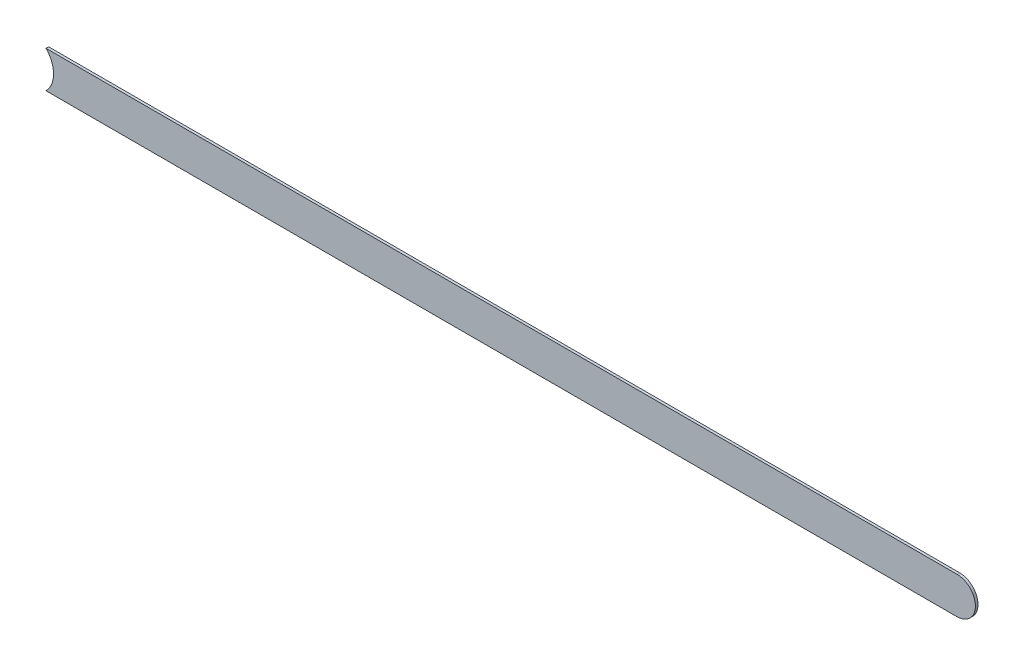
ISO-10303-21;
HEADER;
FILE_DESCRIPTION(('STEP AP214'),'2;1');
FILE_NAME('part.step','',(''),(''),'','','');
FILE_SCHEMA(('AUTOMOTIVE_DESIGN { 1 0 10303 214 1 1 1 1 }'));
ENDSEC;
DATA;
#1=APPLICATION_CONTEXT('core data for automotive mechanical design processes');
#2=APPLICATION_PROTOCOL_DEFINITION('international standard','automotive_design',2000,#1);
#3=PRODUCT_CONTEXT('',#1,'mechanical');
#4=PRODUCT('Part','Part','',(#3));
#5=PRODUCT_RELATED_PRODUCT_CATEGORY('part','',(#4));
#6=PRODUCT_DEFINITION_FORMATION('','',#4);
#7=PRODUCT_DEFINITION_CONTEXT('part definition',#1,'design');
#8=PRODUCT_DEFINITION('design','',#6,#7);
#9=PRODUCT_DEFINITION_SHAPE('','',#8);
#10=(LENGTH_UNIT() NAMED_UNIT(*) SI_UNIT(.MILLI.,.METRE.));
#11=(NAMED_UNIT(*) PLANE_ANGLE_UNIT() SI_UNIT($,.RADIAN.));
#12=(NAMED_UNIT(*) SI_UNIT($,.STERADIAN.) SOLID_ANGLE_UNIT());
#13=UNCERTAINTY_MEASURE_WITH_UNIT(LENGTH_MEASURE(1.E-05),#10,'distance_accuracy_value','');
#14=(GEOMETRIC_REPRESENTATION_CONTEXT(3) GLOBAL_UNCERTAINTY_ASSIGNED_CONTEXT((#13)) GLOBAL_UNIT_ASSIGNED_CONTEXT((#10,
#11,#12)) REPRESENTATION_CONTEXT('',''));
#15=CARTESIAN_POINT('',(0.,0.,0.));
#16=DIRECTION('',(0.,0.,1.));
#17=DIRECTION('',(1.,0.,0.));
#18=AXIS2_PLACEMENT_3D('',#15,#16,#17);
#19=CARTESIAN_POINT('',(55.9157571955931,69.32484738,0.));
#20=DIRECTION('',(0.,1.,0.));
#21=DIRECTION('',(1.,0.,0.));
#22=AXIS2_PLACEMENT_3D('',#19,#20,#21);
#23=PLANE('',#22);
#24=DIRECTION('',(1.,0.,0.));
#25=VECTOR('',#24,1.);
#26=CARTESIAN_POINT('',(55.66287064,69.32484738,0.03556));
#27=LINE('',#26,#25);
#28=CARTESIAN_POINT('',(55.9157571955931,69.32484738,0.03556));
#29=VERTEX_POINT('',#28);
#30=CARTESIAN_POINT('',(68.29635312,69.32484738,0.03556));
#31=VERTEX_POINT('',#30);
#32=EDGE_CURVE('E11',#29,#31,#27,.T.);
#33=ORIENTED_EDGE('',*,*,#32,.F.);
#34=DIRECTION('',(0.,0.,1.));
#35=VECTOR('',#34,1.);
#36=CARTESIAN_POINT('',(55.9157571955931,69.32484738,0.));
#37=LINE('',#36,#35);
#38=CARTESIAN_POINT('',(55.9157571955931,69.32484738,0.));
#39=VERTEX_POINT('',#38);
#40=EDGE_CURVE('E24',#39,#29,#37,.T.);
#41=ORIENTED_EDGE('',*,*,#40,.F.);
#42=DIRECTION('',(1.,0.,0.));
#43=VECTOR('',#42,1.);
#44=CARTESIAN_POINT('',(55.66287064,69.32484738,0.));
#45=LINE('',#44,#43);
#46=CARTESIAN_POINT('',(68.29635312,69.32484738,0.));
#47=VERTEX_POINT('',#46);
#48=EDGE_CURVE('E82',#39,#47,#45,.T.);
#49=ORIENTED_EDGE('',*,*,#48,.T.);
#50=DIRECTION('',(0.,0.,1.));
#51=VECTOR('',#50,1.);
#52=CARTESIAN_POINT('',(68.29635312,69.32484738,0.));
#53=LINE('',#52,#51);
#54=EDGE_CURVE('E37',#47,#31,#53,.T.);
#55=ORIENTED_EDGE('',*,*,#54,.T.);
#56=EDGE_LOOP('',(#33,#41,#49,#55));
#57=FACE_BOUND('',#56,.T.);
#58=ADVANCED_FACE('F17',(#57),#23,.F.);
#59=CARTESIAN_POINT('',(68.29635312,69.57484688,0.));
#60=DIRECTION('',(0.,0.,-1.));
#61=DIRECTION('',(0.,-1.,0.));
#62=AXIS2_PLACEMENT_3D('',#59,#60,#61);
#63=CYLINDRICAL_SURFACE('',#62,0.249999500000001);
#64=CARTESIAN_POINT('',(68.29635312,69.57484688,0.03556));
#65=DIRECTION('',(0.,0.,1.));
#66=DIRECTION('',(0.,-1.,0.));
#67=AXIS2_PLACEMENT_3D('',#64,#65,#66);
#68=CIRCLE('',#67,0.249999500000001);
#69=CARTESIAN_POINT('',(68.29635312,69.82484638,0.03556));
#70=VERTEX_POINT('',#69);
#71=EDGE_CURVE('E97',#31,#70,#68,.T.);
#72=ORIENTED_EDGE('',*,*,#71,.F.);
#73=ORIENTED_EDGE('',*,*,#54,.F.);
#74=CARTESIAN_POINT('',(68.29635312,69.57484688,0.));
#75=DIRECTION('',(0.,0.,1.));
#76=DIRECTION('',(0.,-1.,0.));
#77=AXIS2_PLACEMENT_3D('',#74,#75,#76);
#78=CIRCLE('',#77,0.249999500000001);
#79=CARTESIAN_POINT('',(68.29635312,69.82484638,0.));
#80=VERTEX_POINT('',#79);
#81=EDGE_CURVE('E94',#47,#80,#78,.T.);
#82=ORIENTED_EDGE('',*,*,#81,.T.);
#83=DIRECTION('',(0.,0.,1.));
#84=VECTOR('',#83,1.);
#85=CARTESIAN_POINT('',(68.29635312,69.82484638,0.));
#86=LINE('',#85,#84);
#87=EDGE_CURVE('E92',#80,#70,#86,.T.);
#88=ORIENTED_EDGE('',*,*,#87,.T.);
#89=EDGE_LOOP('',(#72,#73,#82,#88));
#90=FACE_BOUND('',#89,.T.);
#91=ADVANCED_FACE('F103',(#90),#63,.T.);
#92=CARTESIAN_POINT('',(68.29635312,69.82484638,0.));
#93=DIRECTION('',(0.,-1.,0.));
#94=DIRECTION('',(-1.,0.,0.));
#95=AXIS2_PLACEMENT_3D('',#92,#93,#94);
#96=PLANE('',#95);
#97=DIRECTION('',(-1.,0.,0.));
#98=VECTOR('',#97,1.);
#99=CARTESIAN_POINT('',(68.29635312,69.82484638,0.03556));
#100=LINE('',#99,#98);
#101=CARTESIAN_POINT('',(55.9157571955931,69.82484638,0.03556));
#102=VERTEX_POINT('',#101);
#103=EDGE_CURVE('E89',#70,#102,#100,.T.);
#104=ORIENTED_EDGE('',*,*,#103,.F.);
#105=ORIENTED_EDGE('',*,*,#87,.F.);
#106=DIRECTION('',(-1.,0.,0.));
#107=VECTOR('',#106,1.);
#108=CARTESIAN_POINT('',(68.29635312,69.82484638,0.));
#109=LINE('',#108,#107);
#110=CARTESIAN_POINT('',(55.9157571955931,69.82484638,0.));
#111=VERTEX_POINT('',#110);
#112=EDGE_CURVE('E87',#80,#111,#109,.T.);
#113=ORIENTED_EDGE('',*,*,#112,.T.);
#114=DIRECTION('',(0.,0.,1.));
#115=VECTOR('',#114,1.);
#116=CARTESIAN_POINT('',(55.9157571955931,69.82484638,0.));
#117=LINE('',#116,#115);
#118=EDGE_CURVE('E69',#111,#102,#117,.T.);
#119=ORIENTED_EDGE('',*,*,#118,.T.);
#120=EDGE_LOOP('',(#104,#105,#113,#119));
#121=FACE_BOUND('',#120,.T.);
#122=ADVANCED_FACE('F108',(#121),#96,.F.);
#123=CARTESIAN_POINT('',(55.66287064,69.57484688,0.));
#124=DIRECTION('',(0.,0.,-1.));
#125=DIRECTION('',(1.,0.,0.));
#126=AXIS2_PLACEMENT_3D('',#123,#124,#125);
#127=CYLINDRICAL_SURFACE('',#126,0.3556);
#128=DIRECTION('',(0.,0.,1.));
#129=VECTOR('',#128,1.);
#130=CARTESIAN_POINT('',(56.01847064,69.57484688,0.));
#131=LINE('',#130,#129);
#132=CARTESIAN_POINT('',(56.01847064,69.57484688,0.));
#133=VERTEX_POINT('',#132);
#134=CARTESIAN_POINT('',(56.01847064,69.57484688,0.03556));
#135=VERTEX_POINT('',#134);
#136=EDGE_CURVE('E59',#133,#135,#131,.T.);
#137=ORIENTED_EDGE('',*,*,#136,.T.);
#138=CARTESIAN_POINT('',(55.66287064,69.57484688,0.03556));
#139=DIRECTION('',(0.,0.,1.));
#140=DIRECTION('',(1.,0.,0.));
#141=AXIS2_PLACEMENT_3D('',#138,#139,#140);
#142=CIRCLE('',#141,0.3556);
#143=EDGE_CURVE('E70',#135,#102,#142,.T.);
#144=ORIENTED_EDGE('',*,*,#143,.T.);
#145=ORIENTED_EDGE('',*,*,#118,.F.);
#146=CARTESIAN_POINT('',(55.66287064,69.57484688,0.));
#147=DIRECTION('',(0.,0.,1.));
#148=DIRECTION('',(1.,0.,0.));
#149=AXIS2_PLACEMENT_3D('',#146,#147,#148);
#150=CIRCLE('',#149,0.3556);
#151=EDGE_CURVE('E73',#133,#111,#150,.T.);
#152=ORIENTED_EDGE('',*,*,#151,.F.);
#153=EDGE_LOOP('',(#137,#144,#145,#152));
#154=FACE_BOUND('',#153,.T.);
#155=ADVANCED_FACE('F74',(#154),#127,.F.);
#156=CARTESIAN_POINT('',(55.66287064,69.57484688,0.));
#157=DIRECTION('',(0.,0.,-1.));
#158=DIRECTION('',(1.,0.,0.));
#159=AXIS2_PLACEMENT_3D('',#156,#157,#158);
#160=CYLINDRICAL_SURFACE('',#159,0.3556);
#161=ORIENTED_EDGE('',*,*,#40,.T.);
#162=CARTESIAN_POINT('',(55.66287064,69.57484688,0.03556));
#163=DIRECTION('',(0.,0.,1.));
#164=DIRECTION('',(1.,0.,0.));
#165=AXIS2_PLACEMENT_3D('',#162,#163,#164);
#166=CIRCLE('',#165,0.3556);
#167=EDGE_CURVE('E65',#29,#135,#166,.T.);
#168=ORIENTED_EDGE('',*,*,#167,.T.);
#169=ORIENTED_EDGE('',*,*,#136,.F.);
#170=EDGE_CURVE('E63',#39,#133,#150,.T.);
#171=ORIENTED_EDGE('',*,*,#170,.F.);
#172=EDGE_LOOP('',(#161,#168,#169,#171));
#173=FACE_BOUND('',#172,.T.);
#174=ADVANCED_FACE('F61',(#173),#160,.F.);
#175=CARTESIAN_POINT('',(55.66287064,69.32484738,0.));
#176=DIRECTION('',(0.,0.,-1.));
#177=DIRECTION('',(-1.,0.,0.));
#178=AXIS2_PLACEMENT_3D('',#175,#176,#177);
#179=PLANE('',#178);
#180=ORIENTED_EDGE('',*,*,#48,.F.);
#181=ORIENTED_EDGE('',*,*,#170,.T.);
#182=ORIENTED_EDGE('',*,*,#151,.T.);
#183=ORIENTED_EDGE('',*,*,#112,.F.);
#184=ORIENTED_EDGE('',*,*,#81,.F.);
#185=EDGE_LOOP('',(#180,#181,#182,#183,#184));
#186=FACE_BOUND('',#185,.T.);
#187=ADVANCED_FACE('F80',(#186),#179,.T.);
#188=CARTESIAN_POINT('',(55.66287064,69.32484738,0.03556));
#189=DIRECTION('',(0.,0.,-1.));
#190=DIRECTION('',(-1.,0.,0.));
#191=AXIS2_PLACEMENT_3D('',#188,#189,#190);
#192=PLANE('',#191);
#193=ORIENTED_EDGE('',*,*,#167,.F.);
#194=ORIENTED_EDGE('',*,*,#32,.T.);
#195=ORIENTED_EDGE('',*,*,#71,.T.);
#196=ORIENTED_EDGE('',*,*,#103,.T.);
#197=ORIENTED_EDGE('',*,*,#143,.F.);
#198=EDGE_LOOP('',(#193,#194,#195,#196,#197));
#199=FACE_BOUND('',#198,.T.);
#200=ADVANCED_FACE('F106',(#199),#192,.F.);
#201=CLOSED_SHELL('',(#58,#91,#122,#155,#174,#187,#200));
#202=MANIFOLD_SOLID_BREP('B1',#201);
#203=ADVANCED_BREP_SHAPE_REPRESENTATION('',(#18,#202),#14);
#204=SHAPE_DEFINITION_REPRESENTATION(#9,#203);
ENDSEC;
END-ISO-10303-21;
